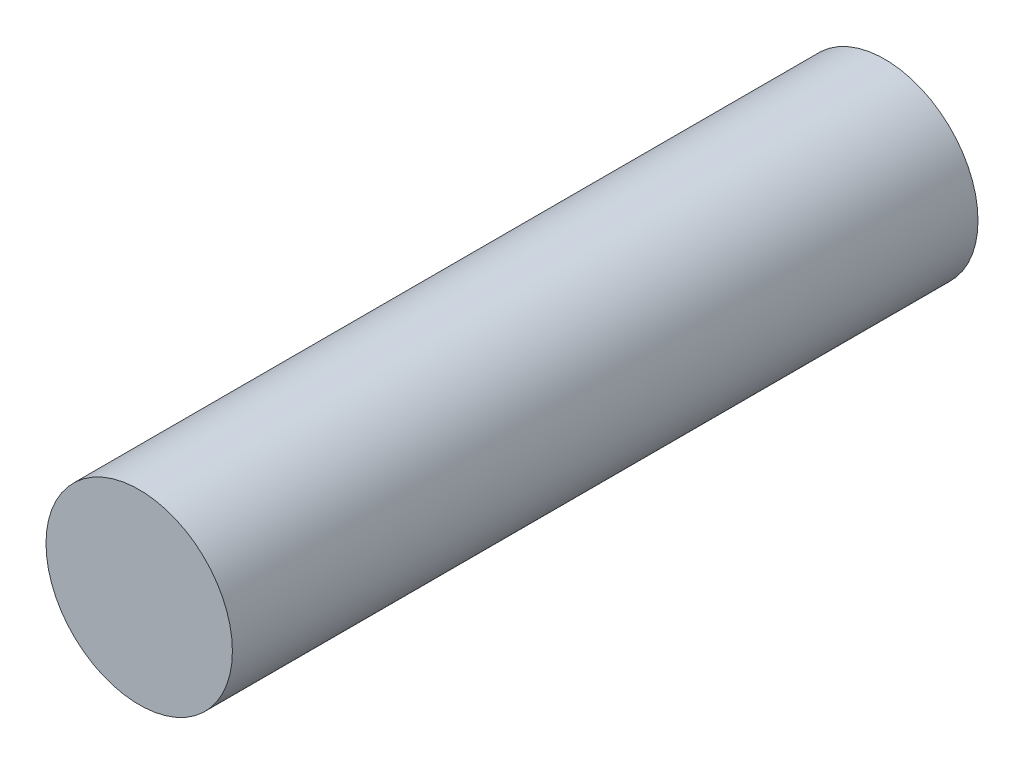
ISO-10303-21;
HEADER;
FILE_DESCRIPTION(('STEP AP214'),'2;1');
FILE_NAME('part.step','',(''),(''),'','','');
FILE_SCHEMA(('AUTOMOTIVE_DESIGN { 1 0 10303 214 1 1 1 1 }'));
ENDSEC;
DATA;
#1=APPLICATION_CONTEXT('core data for automotive mechanical design processes');
#2=APPLICATION_PROTOCOL_DEFINITION('international standard','automotive_design',2000,#1);
#3=PRODUCT_CONTEXT('',#1,'mechanical');
#4=PRODUCT('Part','Part','',(#3));
#5=PRODUCT_RELATED_PRODUCT_CATEGORY('part','',(#4));
#6=PRODUCT_DEFINITION_FORMATION('','',#4);
#7=PRODUCT_DEFINITION_CONTEXT('part definition',#1,'design');
#8=PRODUCT_DEFINITION('design','',#6,#7);
#9=PRODUCT_DEFINITION_SHAPE('','',#8);
#10=(LENGTH_UNIT() NAMED_UNIT(*) SI_UNIT(.MILLI.,.METRE.));
#11=(NAMED_UNIT(*) PLANE_ANGLE_UNIT() SI_UNIT($,.RADIAN.));
#12=(NAMED_UNIT(*) SI_UNIT($,.STERADIAN.) SOLID_ANGLE_UNIT());
#13=UNCERTAINTY_MEASURE_WITH_UNIT(LENGTH_MEASURE(1.E-05),#10,'distance_accuracy_value','');
#14=(GEOMETRIC_REPRESENTATION_CONTEXT(3) GLOBAL_UNCERTAINTY_ASSIGNED_CONTEXT((#13)) GLOBAL_UNIT_ASSIGNED_CONTEXT((#10,
#11,#12)) REPRESENTATION_CONTEXT('',''));
#15=CARTESIAN_POINT('',(0.,0.,0.));
#16=DIRECTION('',(0.,0.,1.));
#17=DIRECTION('',(1.,0.,0.));
#18=AXIS2_PLACEMENT_3D('',#15,#16,#17);
#19=CARTESIAN_POINT('',(0.,0.,79.9999999999999));
#20=DIRECTION('',(0.,0.,-1.));
#21=DIRECTION('',(-1.,0.,0.));
#22=AXIS2_PLACEMENT_3D('',#19,#20,#21);
#23=CYLINDRICAL_SURFACE('',#22,10.);
#24=CARTESIAN_POINT('',(0.,0.,79.9999999999999));
#25=DIRECTION('',(0.,0.,1.));
#26=DIRECTION('',(1.,0.,0.));
#27=AXIS2_PLACEMENT_3D('',#24,#25,#26);
#28=CIRCLE('',#27,10.);
#29=CARTESIAN_POINT('',(10.,0.,79.9999999999999));
#30=VERTEX_POINT('',#29);
#31=EDGE_CURVE('E10',#30,#30,#28,.T.);
#32=ORIENTED_EDGE('',*,*,#31,.F.);
#33=EDGE_LOOP('',(#32));
#34=FACE_BOUND('',#33,.T.);
#35=CARTESIAN_POINT('',(0.,0.,0.));
#36=DIRECTION('',(0.,0.,1.));
#37=DIRECTION('',(1.,0.,0.));
#38=AXIS2_PLACEMENT_3D('',#35,#36,#37);
#39=CIRCLE('',#38,10.);
#40=CARTESIAN_POINT('',(10.,0.,0.));
#41=VERTEX_POINT('',#40);
#42=EDGE_CURVE('E36',#41,#41,#39,.T.);
#43=ORIENTED_EDGE('',*,*,#42,.T.);
#44=EDGE_LOOP('',(#43));
#45=FACE_BOUND('',#44,.T.);
#46=ADVANCED_FACE('F33',(#34,#45),#23,.T.);
#47=CARTESIAN_POINT('',(0.,0.,79.9999999999999));
#48=DIRECTION('',(0.,0.,1.));
#49=DIRECTION('',(1.,0.,0.));
#50=AXIS2_PLACEMENT_3D('',#47,#48,#49);
#51=PLANE('',#50);
#52=ORIENTED_EDGE('',*,*,#31,.T.);
#53=EDGE_LOOP('',(#52));
#54=FACE_BOUND('',#53,.T.);
#55=ADVANCED_FACE('F48',(#54),#51,.T.);
#56=CARTESIAN_POINT('',(0.,0.,0.));
#57=DIRECTION('',(0.,0.,1.));
#58=DIRECTION('',(1.,0.,0.));
#59=AXIS2_PLACEMENT_3D('',#56,#57,#58);
#60=PLANE('',#59);
#61=ORIENTED_EDGE('',*,*,#42,.F.);
#62=EDGE_LOOP('',(#61));
#63=FACE_BOUND('',#62,.T.);
#64=ADVANCED_FACE('F46',(#63),#60,.F.);
#65=CLOSED_SHELL('',(#46,#55,#64));
#66=MANIFOLD_SOLID_BREP('B2',#65);
#67=ADVANCED_BREP_SHAPE_REPRESENTATION('',(#18,#66),#14);
#68=SHAPE_DEFINITION_REPRESENTATION(#9,#67);
ENDSEC;
END-ISO-10303-21;
